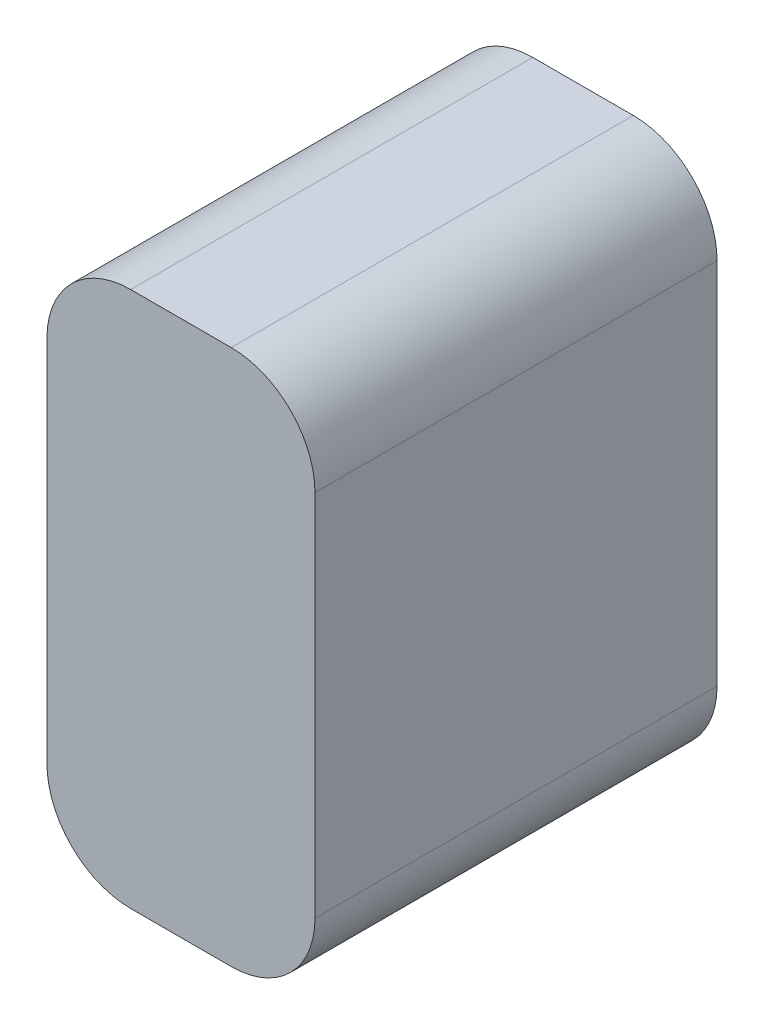
ISO-10303-21;
HEADER;
FILE_DESCRIPTION(('STEP AP214'),'2;1');
FILE_NAME('part.step','',(''),(''),'','','');
FILE_SCHEMA(('AUTOMOTIVE_DESIGN { 1 0 10303 214 1 1 1 1 }'));
ENDSEC;
DATA;
#1=APPLICATION_CONTEXT('core data for automotive mechanical design processes');
#2=APPLICATION_PROTOCOL_DEFINITION('international standard','automotive_design',2000,#1);
#3=PRODUCT_CONTEXT('',#1,'mechanical');
#4=PRODUCT('Part','Part','',(#3));
#5=PRODUCT_RELATED_PRODUCT_CATEGORY('part','',(#4));
#6=PRODUCT_DEFINITION_FORMATION('','',#4);
#7=PRODUCT_DEFINITION_CONTEXT('part definition',#1,'design');
#8=PRODUCT_DEFINITION('design','',#6,#7);
#9=PRODUCT_DEFINITION_SHAPE('','',#8);
#10=(LENGTH_UNIT() NAMED_UNIT(*) SI_UNIT(.MILLI.,.METRE.));
#11=(NAMED_UNIT(*) PLANE_ANGLE_UNIT() SI_UNIT($,.RADIAN.));
#12=(NAMED_UNIT(*) SI_UNIT($,.STERADIAN.) SOLID_ANGLE_UNIT());
#13=UNCERTAINTY_MEASURE_WITH_UNIT(LENGTH_MEASURE(1.E-05),#10,'distance_accuracy_value','');
#14=(GEOMETRIC_REPRESENTATION_CONTEXT(3) GLOBAL_UNCERTAINTY_ASSIGNED_CONTEXT((#13)) GLOBAL_UNIT_ASSIGNED_CONTEXT((#10,
#11,#12)) REPRESENTATION_CONTEXT('',''));
#15=CARTESIAN_POINT('',(0.,0.,0.));
#16=DIRECTION('',(0.,0.,1.));
#17=DIRECTION('',(1.,0.,0.));
#18=AXIS2_PLACEMENT_3D('',#15,#16,#17);
#19=CARTESIAN_POINT('',(-1.5,5.5,27.6432));
#20=DIRECTION('',(0.,0.,-1.));
#21=DIRECTION('',(-1.,0.,0.));
#22=AXIS2_PLACEMENT_3D('',#19,#20,#21);
#23=CYLINDRICAL_SURFACE('',#22,2.5);
#24=DIRECTION('',(0.,0.,1.));
#25=VECTOR('',#24,1.);
#26=CARTESIAN_POINT('',(-1.5,8.,0.));
#27=LINE('',#26,#25);
#28=CARTESIAN_POINT('',(-1.5,8.,0.));
#29=VERTEX_POINT('',#28);
#30=CARTESIAN_POINT('',(-1.5,8.,12.));
#31=VERTEX_POINT('',#30);
#32=EDGE_CURVE('E94',#29,#31,#27,.T.);
#33=ORIENTED_EDGE('',*,*,#32,.F.);
#34=CARTESIAN_POINT('',(-1.5,5.5,0.));
#35=DIRECTION('',(0.,0.,-1.));
#36=DIRECTION('',(-1.,0.,0.));
#37=AXIS2_PLACEMENT_3D('',#34,#35,#36);
#38=CIRCLE('',#37,2.5);
#39=CARTESIAN_POINT('',(-4.,5.5,0.));
#40=VERTEX_POINT('',#39);
#41=EDGE_CURVE('E118',#29,#40,#38,.F.);
#42=ORIENTED_EDGE('',*,*,#41,.T.);
#43=DIRECTION('',(0.,0.,1.));
#44=VECTOR('',#43,1.);
#45=CARTESIAN_POINT('',(-4.,5.5,0.));
#46=LINE('',#45,#44);
#47=CARTESIAN_POINT('',(-4.,5.5,12.));
#48=VERTEX_POINT('',#47);
#49=EDGE_CURVE('E122',#48,#40,#46,.F.);
#50=ORIENTED_EDGE('',*,*,#49,.F.);
#51=CARTESIAN_POINT('',(-1.5,5.5,12.));
#52=DIRECTION('',(0.,0.,-1.));
#53=DIRECTION('',(-1.,0.,0.));
#54=AXIS2_PLACEMENT_3D('',#51,#52,#53);
#55=CIRCLE('',#54,2.5);
#56=EDGE_CURVE('E135',#31,#48,#55,.F.);
#57=ORIENTED_EDGE('',*,*,#56,.F.);
#58=EDGE_LOOP('',(#33,#42,#50,#57));
#59=FACE_BOUND('',#58,.T.);
#60=ADVANCED_FACE('F17',(#59),#23,.T.);
#61=CARTESIAN_POINT('',(-4.,8.,0.));
#62=DIRECTION('',(-1.,0.,0.));
#63=DIRECTION('',(0.,0.,1.));
#64=AXIS2_PLACEMENT_3D('',#61,#62,#63);
#65=PLANE('',#64);
#66=DIRECTION('',(0.,1.,0.));
#67=VECTOR('',#66,1.);
#68=CARTESIAN_POINT('',(-4.,0.,12.));
#69=LINE('',#68,#67);
#70=CARTESIAN_POINT('',(-4.,-5.5,12.));
#71=VERTEX_POINT('',#70);
#72=EDGE_CURVE('E108',#48,#71,#69,.F.);
#73=ORIENTED_EDGE('',*,*,#72,.F.);
#74=ORIENTED_EDGE('',*,*,#49,.T.);
#75=DIRECTION('',(0.,1.,0.));
#76=VECTOR('',#75,1.);
#77=CARTESIAN_POINT('',(-4.,0.,0.));
#78=LINE('',#77,#76);
#79=CARTESIAN_POINT('',(-4.,-5.5,0.));
#80=VERTEX_POINT('',#79);
#81=EDGE_CURVE('E133',#40,#80,#78,.F.);
#82=ORIENTED_EDGE('',*,*,#81,.T.);
#83=DIRECTION('',(0.,0.,-1.));
#84=VECTOR('',#83,1.);
#85=CARTESIAN_POINT('',(-4.,-5.5,27.6432));
#86=LINE('',#85,#84);
#87=EDGE_CURVE('E80',#71,#80,#86,.T.);
#88=ORIENTED_EDGE('',*,*,#87,.F.);
#89=EDGE_LOOP('',(#73,#74,#82,#88));
#90=FACE_BOUND('',#89,.T.);
#91=ADVANCED_FACE('F155',(#90),#65,.T.);
#92=CARTESIAN_POINT('',(-1.5,-5.5,27.6432));
#93=DIRECTION('',(0.,0.,-1.));
#94=DIRECTION('',(-1.,0.,0.));
#95=AXIS2_PLACEMENT_3D('',#92,#93,#94);
#96=CYLINDRICAL_SURFACE('',#95,2.5);
#97=ORIENTED_EDGE('',*,*,#87,.T.);
#98=CARTESIAN_POINT('',(-1.5,-5.5,0.));
#99=DIRECTION('',(0.,0.,-1.));
#100=DIRECTION('',(-1.,0.,0.));
#101=AXIS2_PLACEMENT_3D('',#98,#99,#100);
#102=CIRCLE('',#101,2.5);
#103=CARTESIAN_POINT('',(-1.5,-8.,0.));
#104=VERTEX_POINT('',#103);
#105=EDGE_CURVE('E91',#80,#104,#102,.F.);
#106=ORIENTED_EDGE('',*,*,#105,.T.);
#107=DIRECTION('',(0.,0.,-1.));
#108=VECTOR('',#107,1.);
#109=CARTESIAN_POINT('',(-1.5,-8.,0.));
#110=LINE('',#109,#108);
#111=CARTESIAN_POINT('',(-1.5,-8.,12.));
#112=VERTEX_POINT('',#111);
#113=EDGE_CURVE('E85',#112,#104,#110,.T.);
#114=ORIENTED_EDGE('',*,*,#113,.F.);
#115=CARTESIAN_POINT('',(-1.5,-5.5,12.));
#116=DIRECTION('',(0.,0.,-1.));
#117=DIRECTION('',(-1.,0.,0.));
#118=AXIS2_PLACEMENT_3D('',#115,#116,#117);
#119=CIRCLE('',#118,2.5);
#120=EDGE_CURVE('E20',#71,#112,#119,.F.);
#121=ORIENTED_EDGE('',*,*,#120,.F.);
#122=EDGE_LOOP('',(#97,#106,#114,#121));
#123=FACE_BOUND('',#122,.T.);
#124=ADVANCED_FACE('F87',(#123),#96,.T.);
#125=CARTESIAN_POINT('',(-4.,-8.,0.));
#126=DIRECTION('',(0.,-1.,0.));
#127=DIRECTION('',(0.,0.,-1.));
#128=AXIS2_PLACEMENT_3D('',#125,#126,#127);
#129=PLANE('',#128);
#130=DIRECTION('',(1.,0.,0.));
#131=VECTOR('',#130,1.);
#132=CARTESIAN_POINT('',(0.,-8.,0.));
#133=LINE('',#132,#131);
#134=CARTESIAN_POINT('',(1.5,-8.,0.));
#135=VERTEX_POINT('',#134);
#136=EDGE_CURVE('E131',#104,#135,#133,.T.);
#137=ORIENTED_EDGE('',*,*,#136,.T.);
#138=DIRECTION('',(0.,0.,-1.));
#139=VECTOR('',#138,1.);
#140=CARTESIAN_POINT('',(1.5,-8.,27.6432));
#141=LINE('',#140,#139);
#142=CARTESIAN_POINT('',(1.5,-8.,12.));
#143=VERTEX_POINT('',#142);
#144=EDGE_CURVE('E100',#143,#135,#141,.T.);
#145=ORIENTED_EDGE('',*,*,#144,.F.);
#146=DIRECTION('',(1.,0.,0.));
#147=VECTOR('',#146,1.);
#148=CARTESIAN_POINT('',(0.,-8.,12.));
#149=LINE('',#148,#147);
#150=EDGE_CURVE('E97',#112,#143,#149,.T.);
#151=ORIENTED_EDGE('',*,*,#150,.F.);
#152=ORIENTED_EDGE('',*,*,#113,.T.);
#153=EDGE_LOOP('',(#137,#145,#151,#152));
#154=FACE_BOUND('',#153,.T.);
#155=ADVANCED_FACE('F98',(#154),#129,.T.);
#156=CARTESIAN_POINT('',(4.,8.,0.));
#157=DIRECTION('',(0.,1.,0.));
#158=DIRECTION('',(0.,0.,1.));
#159=AXIS2_PLACEMENT_3D('',#156,#157,#158);
#160=PLANE('',#159);
#161=DIRECTION('',(1.,0.,0.));
#162=VECTOR('',#161,1.);
#163=CARTESIAN_POINT('',(0.,8.,0.));
#164=LINE('',#163,#162);
#165=CARTESIAN_POINT('',(1.5,8.,0.));
#166=VERTEX_POINT('',#165);
#167=EDGE_CURVE('E116',#166,#29,#164,.F.);
#168=ORIENTED_EDGE('',*,*,#167,.T.);
#169=ORIENTED_EDGE('',*,*,#32,.T.);
#170=DIRECTION('',(1.,0.,0.));
#171=VECTOR('',#170,1.);
#172=CARTESIAN_POINT('',(0.,8.,12.));
#173=LINE('',#172,#171);
#174=CARTESIAN_POINT('',(1.5,8.,12.));
#175=VERTEX_POINT('',#174);
#176=EDGE_CURVE('E103',#175,#31,#173,.F.);
#177=ORIENTED_EDGE('',*,*,#176,.F.);
#178=DIRECTION('',(0.,0.,-1.));
#179=VECTOR('',#178,1.);
#180=CARTESIAN_POINT('',(1.5,8.,27.6432));
#181=LINE('',#180,#179);
#182=EDGE_CURVE('E113',#166,#175,#181,.F.);
#183=ORIENTED_EDGE('',*,*,#182,.F.);
#184=EDGE_LOOP('',(#168,#169,#177,#183));
#185=FACE_BOUND('',#184,.T.);
#186=ADVANCED_FACE('F151',(#185),#160,.T.);
#187=CARTESIAN_POINT('',(0.,0.,12.));
#188=DIRECTION('',(0.,0.,1.));
#189=DIRECTION('',(1.,0.,0.));
#190=AXIS2_PLACEMENT_3D('',#187,#188,#189);
#191=PLANE('',#190);
#192=ORIENTED_EDGE('',*,*,#176,.T.);
#193=ORIENTED_EDGE('',*,*,#56,.T.);
#194=ORIENTED_EDGE('',*,*,#72,.T.);
#195=ORIENTED_EDGE('',*,*,#120,.T.);
#196=ORIENTED_EDGE('',*,*,#150,.T.);
#197=CARTESIAN_POINT('',(1.5,-5.5,12.));
#198=DIRECTION('',(0.,0.,-1.));
#199=DIRECTION('',(-1.,0.,0.));
#200=AXIS2_PLACEMENT_3D('',#197,#198,#199);
#201=CIRCLE('',#200,2.5);
#202=CARTESIAN_POINT('',(4.,-5.5,12.));
#203=VERTEX_POINT('',#202);
#204=EDGE_CURVE('E119',#203,#143,#201,.T.);
#205=ORIENTED_EDGE('',*,*,#204,.F.);
#206=DIRECTION('',(0.,1.,0.));
#207=VECTOR('',#206,1.);
#208=CARTESIAN_POINT('',(4.,-8.,12.));
#209=LINE('',#208,#207);
#210=CARTESIAN_POINT('',(4.,5.5,12.));
#211=VERTEX_POINT('',#210);
#212=EDGE_CURVE('E126',#211,#203,#209,.F.);
#213=ORIENTED_EDGE('',*,*,#212,.F.);
#214=CARTESIAN_POINT('',(1.5,5.5,12.));
#215=DIRECTION('',(0.,0.,-1.));
#216=DIRECTION('',(-1.,0.,0.));
#217=AXIS2_PLACEMENT_3D('',#214,#215,#216);
#218=CIRCLE('',#217,2.5);
#219=EDGE_CURVE('E115',#175,#211,#218,.T.);
#220=ORIENTED_EDGE('',*,*,#219,.F.);
#221=EDGE_LOOP('',(#192,#193,#194,#195,#196,#205,#213,#220));
#222=FACE_BOUND('',#221,.T.);
#223=ADVANCED_FACE('F106',(#222),#191,.T.);
#224=CARTESIAN_POINT('',(1.5,-5.5,27.6432));
#225=DIRECTION('',(0.,0.,-1.));
#226=DIRECTION('',(-1.,0.,0.));
#227=AXIS2_PLACEMENT_3D('',#224,#225,#226);
#228=CYLINDRICAL_SURFACE('',#227,2.5);
#229=ORIENTED_EDGE('',*,*,#144,.T.);
#230=CARTESIAN_POINT('',(1.5,-5.5,0.));
#231=DIRECTION('',(0.,0.,-1.));
#232=DIRECTION('',(-1.,0.,0.));
#233=AXIS2_PLACEMENT_3D('',#230,#231,#232);
#234=CIRCLE('',#233,2.5);
#235=CARTESIAN_POINT('',(4.,-5.5,0.));
#236=VERTEX_POINT('',#235);
#237=EDGE_CURVE('E129',#135,#236,#234,.F.);
#238=ORIENTED_EDGE('',*,*,#237,.T.);
#239=DIRECTION('',(0.,0.,-1.));
#240=VECTOR('',#239,1.);
#241=CARTESIAN_POINT('',(4.,-5.5,0.));
#242=LINE('',#241,#240);
#243=EDGE_CURVE('E140',#203,#236,#242,.T.);
#244=ORIENTED_EDGE('',*,*,#243,.F.);
#245=ORIENTED_EDGE('',*,*,#204,.T.);
#246=EDGE_LOOP('',(#229,#238,#244,#245));
#247=FACE_BOUND('',#246,.T.);
#248=ADVANCED_FACE('F158',(#247),#228,.T.);
#249=CARTESIAN_POINT('',(0.,0.,0.));
#250=DIRECTION('',(0.,0.,1.));
#251=DIRECTION('',(1.,0.,0.));
#252=AXIS2_PLACEMENT_3D('',#249,#250,#251);
#253=PLANE('',#252);
#254=CARTESIAN_POINT('',(1.5,5.5,0.));
#255=DIRECTION('',(0.,0.,-1.));
#256=DIRECTION('',(-1.,0.,0.));
#257=AXIS2_PLACEMENT_3D('',#254,#255,#256);
#258=CIRCLE('',#257,2.5);
#259=CARTESIAN_POINT('',(4.,5.5,0.));
#260=VERTEX_POINT('',#259);
#261=EDGE_CURVE('E35',#260,#166,#258,.F.);
#262=ORIENTED_EDGE('',*,*,#261,.F.);
#263=DIRECTION('',(0.,1.,0.));
#264=VECTOR('',#263,1.);
#265=CARTESIAN_POINT('',(4.,-8.,0.));
#266=LINE('',#265,#264);
#267=EDGE_CURVE('E26',#236,#260,#266,.T.);
#268=ORIENTED_EDGE('',*,*,#267,.F.);
#269=ORIENTED_EDGE('',*,*,#237,.F.);
#270=ORIENTED_EDGE('',*,*,#136,.F.);
#271=ORIENTED_EDGE('',*,*,#105,.F.);
#272=ORIENTED_EDGE('',*,*,#81,.F.);
#273=ORIENTED_EDGE('',*,*,#41,.F.);
#274=ORIENTED_EDGE('',*,*,#167,.F.);
#275=EDGE_LOOP('',(#262,#268,#269,#270,#271,#272,#273,#274));
#276=FACE_BOUND('',#275,.T.);
#277=ADVANCED_FACE('F153',(#276),#253,.F.);
#278=CARTESIAN_POINT('',(1.5,5.5,27.6432));
#279=DIRECTION('',(0.,0.,-1.));
#280=DIRECTION('',(-1.,0.,0.));
#281=AXIS2_PLACEMENT_3D('',#278,#279,#280);
#282=CYLINDRICAL_SURFACE('',#281,2.5);
#283=DIRECTION('',(0.,0.,-1.));
#284=VECTOR('',#283,1.);
#285=CARTESIAN_POINT('',(4.,5.5,0.));
#286=LINE('',#285,#284);
#287=EDGE_CURVE('E11',#260,#211,#286,.F.);
#288=ORIENTED_EDGE('',*,*,#287,.F.);
#289=ORIENTED_EDGE('',*,*,#261,.T.);
#290=ORIENTED_EDGE('',*,*,#182,.T.);
#291=ORIENTED_EDGE('',*,*,#219,.T.);
#292=EDGE_LOOP('',(#288,#289,#290,#291));
#293=FACE_BOUND('',#292,.T.);
#294=ADVANCED_FACE('F162',(#293),#282,.T.);
#295=CARTESIAN_POINT('',(4.,-8.,0.));
#296=DIRECTION('',(1.,0.,0.));
#297=DIRECTION('',(0.,0.,-1.));
#298=AXIS2_PLACEMENT_3D('',#295,#296,#297);
#299=PLANE('',#298);
#300=ORIENTED_EDGE('',*,*,#267,.T.);
#301=ORIENTED_EDGE('',*,*,#287,.T.);
#302=ORIENTED_EDGE('',*,*,#212,.T.);
#303=ORIENTED_EDGE('',*,*,#243,.T.);
#304=EDGE_LOOP('',(#300,#301,#302,#303));
#305=FACE_BOUND('',#304,.T.);
#306=ADVANCED_FACE('F163',(#305),#299,.T.);
#307=CLOSED_SHELL('',(#60,#91,#124,#155,#186,#223,#248,#277,#294,#306));
#308=MANIFOLD_SOLID_BREP('B1',#307);
#309=ADVANCED_BREP_SHAPE_REPRESENTATION('',(#18,#308),#14);
#310=SHAPE_DEFINITION_REPRESENTATION(#9,#309);
ENDSEC;
END-ISO-10303-21;
